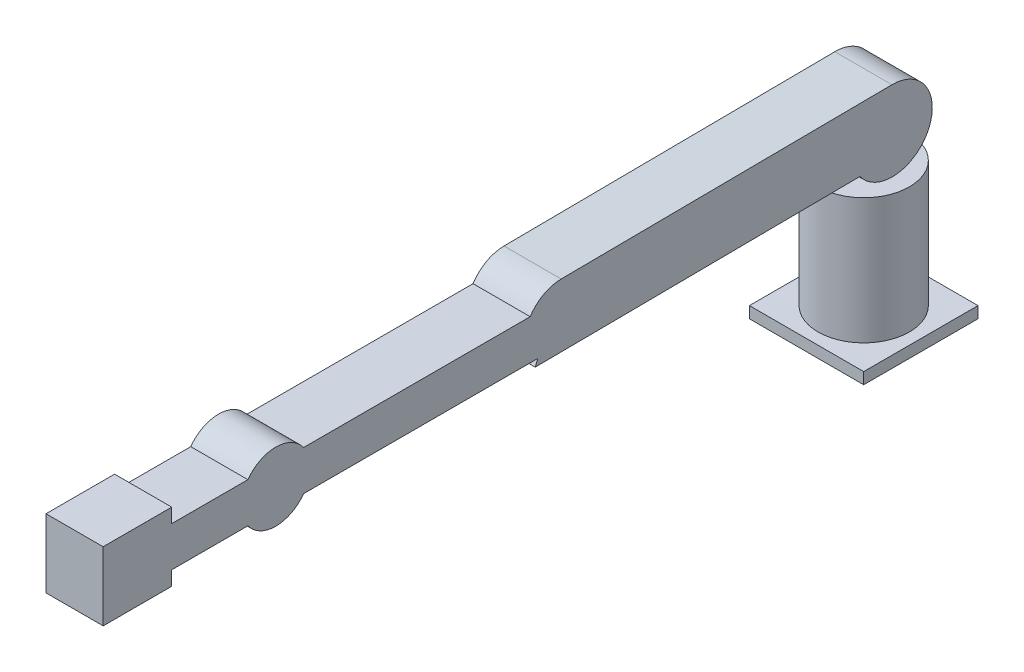
ISO-10303-21;
HEADER;
FILE_DESCRIPTION(('STEP AP214'),'2;1');
FILE_NAME('part.step','',(''),(''),'','','');
FILE_SCHEMA(('AUTOMOTIVE_DESIGN { 1 0 10303 214 1 1 1 1 }'));
ENDSEC;
DATA;
#1=APPLICATION_CONTEXT('core data for automotive mechanical design processes');
#2=APPLICATION_PROTOCOL_DEFINITION('international standard','automotive_design',2000,#1);
#3=PRODUCT_CONTEXT('',#1,'mechanical');
#4=PRODUCT('Part','Part','',(#3));
#5=PRODUCT_RELATED_PRODUCT_CATEGORY('part','',(#4));
#6=PRODUCT_DEFINITION_FORMATION('','',#4);
#7=PRODUCT_DEFINITION_CONTEXT('part definition',#1,'design');
#8=PRODUCT_DEFINITION('design','',#6,#7);
#9=PRODUCT_DEFINITION_SHAPE('','',#8);
#10=(LENGTH_UNIT() NAMED_UNIT(*) SI_UNIT(.MILLI.,.METRE.));
#11=(NAMED_UNIT(*) PLANE_ANGLE_UNIT() SI_UNIT($,.RADIAN.));
#12=(NAMED_UNIT(*) SI_UNIT($,.STERADIAN.) SOLID_ANGLE_UNIT());
#13=UNCERTAINTY_MEASURE_WITH_UNIT(LENGTH_MEASURE(1.E-05),#10,'distance_accuracy_value','');
#14=(GEOMETRIC_REPRESENTATION_CONTEXT(3) GLOBAL_UNCERTAINTY_ASSIGNED_CONTEXT((#13)) GLOBAL_UNIT_ASSIGNED_CONTEXT((#10,
#11,#12)) REPRESENTATION_CONTEXT('',''));
#15=CARTESIAN_POINT('',(0.,0.,0.));
#16=DIRECTION('',(0.,0.,1.));
#17=DIRECTION('',(1.,0.,0.));
#18=AXIS2_PLACEMENT_3D('',#15,#16,#17);
#19=CARTESIAN_POINT('',(-25.,0.,0.));
#20=DIRECTION('',(1.,0.,0.));
#21=DIRECTION('',(0.,0.,-1.));
#22=AXIS2_PLACEMENT_3D('',#19,#20,#21);
#23=PLANE('',#22);
#24=CARTESIAN_POINT('',(-25.,144.999999999996,539.396584387438));
#25=DIRECTION('',(1.,0.,0.));
#26=DIRECTION('',(0.,0.,-1.));
#27=AXIS2_PLACEMENT_3D('',#24,#25,#26);
#28=CIRCLE('',#27,30.);
#29=CARTESIAN_POINT('',(-25.,127.499999999996,563.76357024946));
#30=VERTEX_POINT('',#29);
#31=CARTESIAN_POINT('',(-25.,127.499999999997,515.029598525415));
#32=VERTEX_POINT('',#31);
#33=EDGE_CURVE('E471',#30,#32,#28,.T.);
#34=ORIENTED_EDGE('',*,*,#33,.F.);
#35=DIRECTION('',(0.,0.,1.));
#36=VECTOR('',#35,1.);
#37=CARTESIAN_POINT('',(-25.,127.499999999996,539.396584387437));
#38=LINE('',#37,#36);
#39=CARTESIAN_POINT('',(-25.,127.499999999995,630.396584387437));
#40=VERTEX_POINT('',#39);
#41=EDGE_CURVE('E452',#30,#40,#38,.T.);
#42=ORIENTED_EDGE('',*,*,#41,.T.);
#43=DIRECTION('',(0.,-1.,0.));
#44=VECTOR('',#43,1.);
#45=CARTESIAN_POINT('',(-25.,174.999999999995,630.396584387438));
#46=LINE('',#45,#44);
#47=CARTESIAN_POINT('',(-25.,114.999999999995,630.396584387437));
#48=VERTEX_POINT('',#47);
#49=EDGE_CURVE('E365',#40,#48,#46,.T.);
#50=ORIENTED_EDGE('',*,*,#49,.T.);
#51=DIRECTION('',(0.,0.,1.));
#52=VECTOR('',#51,1.);
#53=CARTESIAN_POINT('',(-25.,114.999999999995,630.396584387437));
#54=LINE('',#53,#52);
#55=CARTESIAN_POINT('',(-25.,114.999999999994,690.396584387437));
#56=VERTEX_POINT('',#55);
#57=EDGE_CURVE('E375',#48,#56,#54,.T.);
#58=ORIENTED_EDGE('',*,*,#57,.T.);
#59=DIRECTION('',(0.,1.,0.));
#60=VECTOR('',#59,1.);
#61=CARTESIAN_POINT('',(-25.,114.999999999994,690.396584387437));
#62=LINE('',#61,#60);
#63=CARTESIAN_POINT('',(-25.,174.999999999994,690.396584387438));
#64=VERTEX_POINT('',#63);
#65=EDGE_CURVE('E386',#56,#64,#62,.T.);
#66=ORIENTED_EDGE('',*,*,#65,.T.);
#67=DIRECTION('',(0.,0.,-1.));
#68=VECTOR('',#67,1.);
#69=CARTESIAN_POINT('',(-25.,174.999999999994,690.396584387438));
#70=LINE('',#69,#68);
#71=CARTESIAN_POINT('',(-25.,174.999999999995,630.396584387438));
#72=VERTEX_POINT('',#71);
#73=EDGE_CURVE('E391',#64,#72,#70,.T.);
#74=ORIENTED_EDGE('',*,*,#73,.T.);
#75=CARTESIAN_POINT('',(-25.,162.499999999995,630.396584387438));
#76=VERTEX_POINT('',#75);
#77=EDGE_CURVE('E396',#72,#76,#46,.T.);
#78=ORIENTED_EDGE('',*,*,#77,.T.);
#79=DIRECTION('',(0.,0.,-1.));
#80=VECTOR('',#79,1.);
#81=CARTESIAN_POINT('',(-25.,162.499999999995,630.396584387438));
#82=LINE('',#81,#80);
#83=CARTESIAN_POINT('',(-25.,162.499999999996,563.76357024946));
#84=VERTEX_POINT('',#83);
#85=EDGE_CURVE('E457',#76,#84,#82,.T.);
#86=ORIENTED_EDGE('',*,*,#85,.T.);
#87=CARTESIAN_POINT('',(-25.,162.499999999997,515.029598525415));
#88=VERTEX_POINT('',#87);
#89=EDGE_CURVE('E382',#88,#84,#28,.T.);
#90=ORIENTED_EDGE('',*,*,#89,.F.);
#91=DIRECTION('',(0.,0.,-1.));
#92=VECTOR('',#91,1.);
#93=CARTESIAN_POINT('',(-25.,162.499999999996,539.396584387438));
#94=LINE('',#93,#92);
#95=CARTESIAN_POINT('',(-25.,162.5,316.782712262696));
#96=VERTEX_POINT('',#95);
#97=EDGE_CURVE('E420',#88,#96,#94,.T.);
#98=ORIENTED_EDGE('',*,*,#97,.T.);
#99=CARTESIAN_POINT('',(-25.,145.,289.396584387437));
#100=DIRECTION('',(1.,0.,0.));
#101=DIRECTION('',(0.,0.,-1.));
#102=AXIS2_PLACEMENT_3D('',#99,#100,#101);
#103=CIRCLE('',#102,32.5000000000001);
#104=CARTESIAN_POINT('',(-25.,177.498787296354,289.677340983691));
#105=VERTEX_POINT('',#104);
#106=EDGE_CURVE('E519',#105,#96,#103,.T.);
#107=ORIENTED_EDGE('',*,*,#106,.F.);
#108=DIRECTION('',(0.,0.00863866450010712,-0.999962686041661));
#109=VECTOR('',#108,1.);
#110=CARTESIAN_POINT('',(-25.,177.498787296354,289.677340983691));
#111=LINE('',#110,#109);
#112=CARTESIAN_POINT('',(-25.,179.998694011458,0.302353257503749));
#113=VERTEX_POINT('',#112);
#114=EDGE_CURVE('E431',#105,#113,#111,.T.);
#115=ORIENTED_EDGE('',*,*,#114,.T.);
#116=CARTESIAN_POINT('',(-25.,145.,0.));
#117=DIRECTION('',(1.,0.,0.));
#118=DIRECTION('',(0.,0.,-1.));
#119=AXIS2_PLACEMENT_3D('',#116,#117,#118);
#120=CIRCLE('',#119,35.);
#121=CARTESIAN_POINT('',(-25.,124.472753688617,28.3484066372663));
#122=VERTEX_POINT('',#121);
#123=EDGE_CURVE('E527',#122,#113,#120,.T.);
#124=ORIENTED_EDGE('',*,*,#123,.F.);
#125=DIRECTION('',(0.,-0.00863866450010713,0.999962686041662));
#126=VECTOR('',#125,1.);
#127=CARTESIAN_POINT('',(-25.,124.708347955781,1.07735377868663));
#128=LINE('',#127,#126);
#129=CARTESIAN_POINT('',(-25.,122.019029611437,312.377554776));
#130=VERTEX_POINT('',#129);
#131=EDGE_CURVE('E559',#122,#130,#128,.T.);
#132=ORIENTED_EDGE('',*,*,#131,.T.);
#133=DIRECTION('',(0.,-0.925523866381089,0.378689282603825));
#134=VECTOR('',#133,1.);
#135=CARTESIAN_POINT('',(-25.,126.982158806123,310.34683044519));
#136=LINE('',#135,#134);
#137=CARTESIAN_POINT('',(-25.,127.5,310.134949458286));
#138=VERTEX_POINT('',#137);
#139=EDGE_CURVE('E531',#138,#130,#136,.T.);
#140=ORIENTED_EDGE('',*,*,#139,.F.);
#141=DIRECTION('',(0.,0.,1.));
#142=VECTOR('',#141,1.);
#143=CARTESIAN_POINT('',(-25.,127.5,289.396584387437));
#144=LINE('',#143,#142);
#145=EDGE_CURVE('E438',#138,#32,#144,.T.);
#146=ORIENTED_EDGE('',*,*,#145,.T.);
#147=EDGE_LOOP('',(#34,#42,#50,#58,#66,#74,#78,#86,#90,#98,#107,#115,#124,#132,#140,#146));
#148=FACE_BOUND('',#147,.T.);
#149=ADVANCED_FACE('F255',(#148),#23,.F.);
#150=CARTESIAN_POINT('',(25.,145.,0.));
#151=DIRECTION('',(-1.,0.,0.));
#152=DIRECTION('',(0.,0.,1.));
#153=AXIS2_PLACEMENT_3D('',#150,#151,#152);
#154=CYLINDRICAL_SURFACE('',#153,35.);
#155=DIRECTION('',(-1.,0.,0.));
#156=VECTOR('',#155,1.);
#157=CARTESIAN_POINT('',(25.,179.998694011458,0.30235325750375));
#158=LINE('',#157,#156);
#159=CARTESIAN_POINT('',(25.,179.998694011458,0.30235325750375));
#160=VERTEX_POINT('',#159);
#161=EDGE_CURVE('E13',#160,#113,#158,.T.);
#162=ORIENTED_EDGE('',*,*,#161,.F.);
#163=CARTESIAN_POINT('',(25.,145.,0.));
#164=DIRECTION('',(1.,0.,0.));
#165=DIRECTION('',(0.,0.,-1.));
#166=AXIS2_PLACEMENT_3D('',#163,#164,#165);
#167=CIRCLE('',#166,35.);
#168=CARTESIAN_POINT('',(25.,124.472753688617,28.3484066372663));
#169=VERTEX_POINT('',#168);
#170=EDGE_CURVE('E545',#169,#160,#167,.T.);
#171=ORIENTED_EDGE('',*,*,#170,.F.);
#172=DIRECTION('',(-1.,0.,0.));
#173=VECTOR('',#172,1.);
#174=CARTESIAN_POINT('',(25.,124.472753688617,28.3484066372663));
#175=LINE('',#174,#173);
#176=EDGE_CURVE('E266',#169,#122,#175,.T.);
#177=ORIENTED_EDGE('',*,*,#176,.T.);
#178=ORIENTED_EDGE('',*,*,#123,.T.);
#179=EDGE_LOOP('',(#162,#171,#177,#178));
#180=FACE_BOUND('',#179,.T.);
#181=ADVANCED_FACE('F542',(#180),#154,.T.);
#182=CARTESIAN_POINT('',(25.,0.,0.));
#183=DIRECTION('',(1.,0.,0.));
#184=DIRECTION('',(0.,0.,-1.));
#185=AXIS2_PLACEMENT_3D('',#182,#183,#184);
#186=PLANE('',#185);
#187=DIRECTION('',(0.,0.,1.));
#188=VECTOR('',#187,1.);
#189=CARTESIAN_POINT('',(25.,127.499999999996,539.396584387437));
#190=LINE('',#189,#188);
#191=CARTESIAN_POINT('',(25.,127.499999999996,563.76357024946));
#192=VERTEX_POINT('',#191);
#193=CARTESIAN_POINT('',(25.,127.499999999995,630.396584387437));
#194=VERTEX_POINT('',#193);
#195=EDGE_CURVE('E451',#192,#194,#190,.T.);
#196=ORIENTED_EDGE('',*,*,#195,.F.);
#197=CARTESIAN_POINT('',(25.,144.999999999996,539.396584387438));
#198=DIRECTION('',(1.,0.,0.));
#199=DIRECTION('',(0.,0.,-1.));
#200=AXIS2_PLACEMENT_3D('',#197,#198,#199);
#201=CIRCLE('',#200,30.);
#202=CARTESIAN_POINT('',(25.,127.499999999997,515.029598525415));
#203=VERTEX_POINT('',#202);
#204=EDGE_CURVE('E461',#192,#203,#201,.T.);
#205=ORIENTED_EDGE('',*,*,#204,.T.);
#206=DIRECTION('',(0.,0.,1.));
#207=VECTOR('',#206,1.);
#208=CARTESIAN_POINT('',(25.,127.5,289.396584387437));
#209=LINE('',#208,#207);
#210=CARTESIAN_POINT('',(25.,127.5,310.134949458286));
#211=VERTEX_POINT('',#210);
#212=EDGE_CURVE('E423',#211,#203,#209,.T.);
#213=ORIENTED_EDGE('',*,*,#212,.F.);
#214=DIRECTION('',(0.,-0.925523866381089,0.378689282603825));
#215=VECTOR('',#214,1.);
#216=CARTESIAN_POINT('',(25.,126.982158806123,310.34683044519));
#217=LINE('',#216,#215);
#218=CARTESIAN_POINT('',(25.,122.019029611437,312.377554776));
#219=VERTEX_POINT('',#218);
#220=EDGE_CURVE('E552',#211,#219,#217,.T.);
#221=ORIENTED_EDGE('',*,*,#220,.T.);
#222=DIRECTION('',(0.,-0.00863866450010713,0.999962686041662));
#223=VECTOR('',#222,1.);
#224=CARTESIAN_POINT('',(25.,124.708347955781,1.07735377868663));
#225=LINE('',#224,#223);
#226=EDGE_CURVE('E275',#169,#219,#225,.T.);
#227=ORIENTED_EDGE('',*,*,#226,.F.);
#228=ORIENTED_EDGE('',*,*,#170,.T.);
#229=DIRECTION('',(0.,0.00863866450010712,-0.999962686041661));
#230=VECTOR('',#229,1.);
#231=CARTESIAN_POINT('',(25.,177.498787296354,289.677340983691));
#232=LINE('',#231,#230);
#233=CARTESIAN_POINT('',(25.,177.498787296354,289.677340983691));
#234=VERTEX_POINT('',#233);
#235=EDGE_CURVE('E528',#234,#160,#232,.T.);
#236=ORIENTED_EDGE('',*,*,#235,.F.);
#237=CARTESIAN_POINT('',(25.,145.,289.396584387437));
#238=DIRECTION('',(1.,0.,0.));
#239=DIRECTION('',(0.,0.,-1.));
#240=AXIS2_PLACEMENT_3D('',#237,#238,#239);
#241=CIRCLE('',#240,32.5000000000001);
#242=CARTESIAN_POINT('',(25.,162.5,316.782712262696));
#243=VERTEX_POINT('',#242);
#244=EDGE_CURVE('E511',#234,#243,#241,.T.);
#245=ORIENTED_EDGE('',*,*,#244,.T.);
#246=DIRECTION('',(0.,0.,-1.));
#247=VECTOR('',#246,1.);
#248=CARTESIAN_POINT('',(25.,162.499999999996,539.396584387438));
#249=LINE('',#248,#247);
#250=CARTESIAN_POINT('',(25.,162.499999999997,515.029598525415));
#251=VERTEX_POINT('',#250);
#252=EDGE_CURVE('E432',#251,#243,#249,.T.);
#253=ORIENTED_EDGE('',*,*,#252,.F.);
#254=CARTESIAN_POINT('',(25.,162.499999999996,563.76357024946));
#255=VERTEX_POINT('',#254);
#256=EDGE_CURVE('E468',#251,#255,#201,.T.);
#257=ORIENTED_EDGE('',*,*,#256,.T.);
#258=DIRECTION('',(0.,0.,-1.));
#259=VECTOR('',#258,1.);
#260=CARTESIAN_POINT('',(25.,162.499999999995,630.396584387438));
#261=LINE('',#260,#259);
#262=CARTESIAN_POINT('',(25.,162.499999999995,630.396584387438));
#263=VERTEX_POINT('',#262);
#264=EDGE_CURVE('E447',#263,#255,#261,.T.);
#265=ORIENTED_EDGE('',*,*,#264,.F.);
#266=DIRECTION('',(0.,-1.,0.));
#267=VECTOR('',#266,1.);
#268=CARTESIAN_POINT('',(25.,174.999999999995,630.396584387438));
#269=LINE('',#268,#267);
#270=CARTESIAN_POINT('',(25.,174.999999999995,630.396584387438));
#271=VERTEX_POINT('',#270);
#272=EDGE_CURVE('E479',#271,#263,#269,.T.);
#273=ORIENTED_EDGE('',*,*,#272,.F.);
#274=DIRECTION('',(0.,0.,-1.));
#275=VECTOR('',#274,1.);
#276=CARTESIAN_POINT('',(25.,174.999999999994,690.396584387438));
#277=LINE('',#276,#275);
#278=CARTESIAN_POINT('',(25.,174.999999999994,690.396584387438));
#279=VERTEX_POINT('',#278);
#280=EDGE_CURVE('E400',#279,#271,#277,.T.);
#281=ORIENTED_EDGE('',*,*,#280,.F.);
#282=DIRECTION('',(0.,1.,0.));
#283=VECTOR('',#282,1.);
#284=CARTESIAN_POINT('',(25.,114.999999999994,690.396584387437));
#285=LINE('',#284,#283);
#286=CARTESIAN_POINT('',(25.,114.999999999994,690.396584387437));
#287=VERTEX_POINT('',#286);
#288=EDGE_CURVE('E395',#287,#279,#285,.T.);
#289=ORIENTED_EDGE('',*,*,#288,.F.);
#290=DIRECTION('',(0.,0.,1.));
#291=VECTOR('',#290,1.);
#292=CARTESIAN_POINT('',(25.,114.999999999995,630.396584387437));
#293=LINE('',#292,#291);
#294=CARTESIAN_POINT('',(25.,114.999999999995,630.396584387437));
#295=VERTEX_POINT('',#294);
#296=EDGE_CURVE('E377',#295,#287,#293,.T.);
#297=ORIENTED_EDGE('',*,*,#296,.F.);
#298=EDGE_CURVE('E478',#194,#295,#269,.T.);
#299=ORIENTED_EDGE('',*,*,#298,.F.);
#300=EDGE_LOOP('',(#196,#205,#213,#221,#227,#228,#236,#245,#253,#257,#265,#273,#281,#289,#297,#299));
#301=FACE_BOUND('',#300,.T.);
#302=ADVANCED_FACE('F568',(#301),#186,.T.);
#303=CARTESIAN_POINT('',(25.,114.999999999994,690.396584387437));
#304=DIRECTION('',(0.,0.,1.));
#305=DIRECTION('',(0.,-1.,0.));
#306=AXIS2_PLACEMENT_3D('',#303,#304,#305);
#307=PLANE('',#306);
#308=ORIENTED_EDGE('',*,*,#65,.F.);
#309=DIRECTION('',(-1.,0.,0.));
#310=VECTOR('',#309,1.);
#311=CARTESIAN_POINT('',(25.,114.999999999994,690.396584387437));
#312=LINE('',#311,#310);
#313=EDGE_CURVE('E371',#287,#56,#312,.T.);
#314=ORIENTED_EDGE('',*,*,#313,.F.);
#315=ORIENTED_EDGE('',*,*,#288,.T.);
#316=DIRECTION('',(-1.,0.,0.));
#317=VECTOR('',#316,1.);
#318=CARTESIAN_POINT('',(25.,174.999999999994,690.396584387438));
#319=LINE('',#318,#317);
#320=EDGE_CURVE('E387',#279,#64,#319,.T.);
#321=ORIENTED_EDGE('',*,*,#320,.T.);
#322=EDGE_LOOP('',(#308,#314,#315,#321));
#323=FACE_BOUND('',#322,.T.);
#324=ADVANCED_FACE('F257',(#323),#307,.T.);
#325=CARTESIAN_POINT('',(25.,114.999999999995,630.396584387437));
#326=DIRECTION('',(0.,-1.,0.));
#327=DIRECTION('',(0.,0.,-1.));
#328=AXIS2_PLACEMENT_3D('',#325,#326,#327);
#329=PLANE('',#328);
#330=ORIENTED_EDGE('',*,*,#57,.F.);
#331=DIRECTION('',(-1.,0.,0.));
#332=VECTOR('',#331,1.);
#333=CARTESIAN_POINT('',(25.,114.999999999995,630.396584387437));
#334=LINE('',#333,#332);
#335=EDGE_CURVE('E383',#295,#48,#334,.T.);
#336=ORIENTED_EDGE('',*,*,#335,.F.);
#337=ORIENTED_EDGE('',*,*,#296,.T.);
#338=ORIENTED_EDGE('',*,*,#313,.T.);
#339=EDGE_LOOP('',(#330,#336,#337,#338));
#340=FACE_BOUND('',#339,.T.);
#341=ADVANCED_FACE('F373',(#340),#329,.T.);
#342=CARTESIAN_POINT('',(25.,174.999999999994,690.396584387438));
#343=DIRECTION('',(0.,1.,0.));
#344=DIRECTION('',(0.,0.,1.));
#345=AXIS2_PLACEMENT_3D('',#342,#343,#344);
#346=PLANE('',#345);
#347=ORIENTED_EDGE('',*,*,#73,.F.);
#348=ORIENTED_EDGE('',*,*,#320,.F.);
#349=ORIENTED_EDGE('',*,*,#280,.T.);
#350=DIRECTION('',(-1.,0.,0.));
#351=VECTOR('',#350,1.);
#352=CARTESIAN_POINT('',(25.,174.999999999995,630.396584387438));
#353=LINE('',#352,#351);
#354=EDGE_CURVE('E408',#271,#72,#353,.T.);
#355=ORIENTED_EDGE('',*,*,#354,.T.);
#356=EDGE_LOOP('',(#347,#348,#349,#355));
#357=FACE_BOUND('',#356,.T.);
#358=ADVANCED_FACE('F489',(#357),#346,.T.);
#359=CARTESIAN_POINT('',(25.,174.999999999995,630.396584387438));
#360=DIRECTION('',(0.,0.,-1.));
#361=DIRECTION('',(0.,1.,0.));
#362=AXIS2_PLACEMENT_3D('',#359,#360,#361);
#363=PLANE('',#362);
#364=DIRECTION('',(-1.,0.,0.));
#365=VECTOR('',#364,1.);
#366=CARTESIAN_POINT('',(25.,127.499999999995,630.396584387437));
#367=LINE('',#366,#365);
#368=EDGE_CURVE('E456',#194,#40,#367,.T.);
#369=ORIENTED_EDGE('',*,*,#368,.F.);
#370=ORIENTED_EDGE('',*,*,#298,.T.);
#371=ORIENTED_EDGE('',*,*,#335,.T.);
#372=ORIENTED_EDGE('',*,*,#49,.F.);
#373=EDGE_LOOP('',(#369,#370,#371,#372));
#374=FACE_BOUND('',#373,.T.);
#375=ADVANCED_FACE('F682',(#374),#363,.T.);
#376=ORIENTED_EDGE('',*,*,#272,.T.);
#377=DIRECTION('',(-1.,0.,0.));
#378=VECTOR('',#377,1.);
#379=CARTESIAN_POINT('',(25.,162.499999999995,630.396584387438));
#380=LINE('',#379,#378);
#381=EDGE_CURVE('E417',#263,#76,#380,.T.);
#382=ORIENTED_EDGE('',*,*,#381,.T.);
#383=ORIENTED_EDGE('',*,*,#77,.F.);
#384=ORIENTED_EDGE('',*,*,#354,.F.);
#385=EDGE_LOOP('',(#376,#382,#383,#384));
#386=FACE_BOUND('',#385,.T.);
#387=ADVANCED_FACE('F493',(#386),#363,.T.);
#388=CARTESIAN_POINT('',(25.,127.499999999996,539.396584387437));
#389=DIRECTION('',(0.,-1.,0.));
#390=DIRECTION('',(0.,0.,-1.));
#391=AXIS2_PLACEMENT_3D('',#388,#389,#390);
#392=PLANE('',#391);
#393=ORIENTED_EDGE('',*,*,#41,.F.);
#394=DIRECTION('',(-1.,0.,0.));
#395=VECTOR('',#394,1.);
#396=CARTESIAN_POINT('',(25.,127.499999999996,563.76357024946));
#397=LINE('',#396,#395);
#398=EDGE_CURVE('E413',#30,#192,#397,.F.);
#399=ORIENTED_EDGE('',*,*,#398,.T.);
#400=ORIENTED_EDGE('',*,*,#195,.T.);
#401=ORIENTED_EDGE('',*,*,#368,.T.);
#402=EDGE_LOOP('',(#393,#399,#400,#401));
#403=FACE_BOUND('',#402,.T.);
#404=ADVANCED_FACE('F609',(#403),#392,.T.);
#405=CARTESIAN_POINT('',(25.,162.499999999995,630.396584387438));
#406=DIRECTION('',(0.,1.,0.));
#407=DIRECTION('',(0.,0.,1.));
#408=AXIS2_PLACEMENT_3D('',#405,#406,#407);
#409=PLANE('',#408);
#410=ORIENTED_EDGE('',*,*,#264,.T.);
#411=DIRECTION('',(-1.,0.,0.));
#412=VECTOR('',#411,1.);
#413=CARTESIAN_POINT('',(25.,162.499999999996,563.76357024946));
#414=LINE('',#413,#412);
#415=EDGE_CURVE('E416',#255,#84,#414,.T.);
#416=ORIENTED_EDGE('',*,*,#415,.T.);
#417=ORIENTED_EDGE('',*,*,#85,.F.);
#418=ORIENTED_EDGE('',*,*,#381,.F.);
#419=EDGE_LOOP('',(#410,#416,#417,#418));
#420=FACE_BOUND('',#419,.T.);
#421=ADVANCED_FACE('F496',(#420),#409,.T.);
#422=CARTESIAN_POINT('',(25.,144.999999999996,539.396584387438));
#423=DIRECTION('',(-1.,0.,0.));
#424=DIRECTION('',(0.,0.,1.));
#425=AXIS2_PLACEMENT_3D('',#422,#423,#424);
#426=CYLINDRICAL_SURFACE('',#425,30.);
#427=DIRECTION('',(-1.,0.,0.));
#428=VECTOR('',#427,1.);
#429=CARTESIAN_POINT('',(25.,127.499999999997,515.029598525415));
#430=LINE('',#429,#428);
#431=EDGE_CURVE('E259',#203,#32,#430,.T.);
#432=ORIENTED_EDGE('',*,*,#431,.F.);
#433=ORIENTED_EDGE('',*,*,#204,.F.);
#434=ORIENTED_EDGE('',*,*,#398,.F.);
#435=ORIENTED_EDGE('',*,*,#33,.T.);
#436=EDGE_LOOP('',(#432,#433,#434,#435));
#437=FACE_BOUND('',#436,.T.);
#438=ADVANCED_FACE('F572',(#437),#426,.T.);
#439=DIRECTION('',(-1.,0.,0.));
#440=VECTOR('',#439,1.);
#441=CARTESIAN_POINT('',(25.,162.499999999997,515.029598525415));
#442=LINE('',#441,#440);
#443=EDGE_CURVE('E421',#88,#251,#442,.F.);
#444=ORIENTED_EDGE('',*,*,#443,.F.);
#445=ORIENTED_EDGE('',*,*,#89,.T.);
#446=ORIENTED_EDGE('',*,*,#415,.F.);
#447=ORIENTED_EDGE('',*,*,#256,.F.);
#448=EDGE_LOOP('',(#444,#445,#446,#447));
#449=FACE_BOUND('',#448,.T.);
#450=ADVANCED_FACE('F569',(#449),#426,.T.);
#451=CARTESIAN_POINT('',(25.,127.5,289.396584387437));
#452=DIRECTION('',(0.,-1.,0.));
#453=DIRECTION('',(0.,0.,-1.));
#454=AXIS2_PLACEMENT_3D('',#451,#452,#453);
#455=PLANE('',#454);
#456=DIRECTION('',(-1.,0.,0.));
#457=VECTOR('',#456,1.);
#458=CARTESIAN_POINT('',(25.,127.5,310.134949458286));
#459=LINE('',#458,#457);
#460=EDGE_CURVE('E515',#211,#138,#459,.T.);
#461=ORIENTED_EDGE('',*,*,#460,.F.);
#462=ORIENTED_EDGE('',*,*,#212,.T.);
#463=ORIENTED_EDGE('',*,*,#431,.T.);
#464=ORIENTED_EDGE('',*,*,#145,.F.);
#465=EDGE_LOOP('',(#461,#462,#463,#464));
#466=FACE_BOUND('',#465,.T.);
#467=ADVANCED_FACE('F571',(#466),#455,.T.);
#468=CARTESIAN_POINT('',(25.,162.499999999996,539.396584387438));
#469=DIRECTION('',(0.,1.,0.));
#470=DIRECTION('',(0.,0.,1.));
#471=AXIS2_PLACEMENT_3D('',#468,#469,#470);
#472=PLANE('',#471);
#473=DIRECTION('',(-1.,0.,0.));
#474=VECTOR('',#473,1.);
#475=CARTESIAN_POINT('',(25.,162.5,316.782712262696));
#476=LINE('',#475,#474);
#477=EDGE_CURVE('E504',#243,#96,#476,.T.);
#478=ORIENTED_EDGE('',*,*,#477,.T.);
#479=ORIENTED_EDGE('',*,*,#97,.F.);
#480=ORIENTED_EDGE('',*,*,#443,.T.);
#481=ORIENTED_EDGE('',*,*,#252,.T.);
#482=EDGE_LOOP('',(#478,#479,#480,#481));
#483=FACE_BOUND('',#482,.T.);
#484=ADVANCED_FACE('F503',(#483),#472,.T.);
#485=CARTESIAN_POINT('',(25.,126.982158806123,310.34683044519));
#486=DIRECTION('',(0.,-0.378689282603825,-0.925523866381089));
#487=DIRECTION('',(0.,0.925523866381089,-0.378689282603825));
#488=AXIS2_PLACEMENT_3D('',#485,#486,#487);
#489=PLANE('',#488);
#490=ORIENTED_EDGE('',*,*,#139,.T.);
#491=DIRECTION('',(-1.,0.,0.));
#492=VECTOR('',#491,1.);
#493=CARTESIAN_POINT('',(25.,122.019029611437,312.377554776));
#494=LINE('',#493,#492);
#495=EDGE_CURVE('E510',#219,#130,#494,.T.);
#496=ORIENTED_EDGE('',*,*,#495,.F.);
#497=ORIENTED_EDGE('',*,*,#220,.F.);
#498=ORIENTED_EDGE('',*,*,#460,.T.);
#499=EDGE_LOOP('',(#490,#496,#497,#498));
#500=FACE_BOUND('',#499,.T.);
#501=ADVANCED_FACE('F598',(#500),#489,.F.);
#502=CARTESIAN_POINT('',(25.,145.,289.396584387437));
#503=DIRECTION('',(-1.,0.,0.));
#504=DIRECTION('',(0.,0.,1.));
#505=AXIS2_PLACEMENT_3D('',#502,#503,#504);
#506=CYLINDRICAL_SURFACE('',#505,32.5000000000001);
#507=ORIENTED_EDGE('',*,*,#244,.F.);
#508=DIRECTION('',(-1.,0.,0.));
#509=VECTOR('',#508,1.);
#510=CARTESIAN_POINT('',(25.,177.498787296354,289.677340983691));
#511=LINE('',#510,#509);
#512=EDGE_CURVE('E524',#234,#105,#511,.T.);
#513=ORIENTED_EDGE('',*,*,#512,.T.);
#514=ORIENTED_EDGE('',*,*,#106,.T.);
#515=ORIENTED_EDGE('',*,*,#477,.F.);
#516=EDGE_LOOP('',(#507,#513,#514,#515));
#517=FACE_BOUND('',#516,.T.);
#518=ADVANCED_FACE('F564',(#517),#506,.T.);
#519=CARTESIAN_POINT('',(25.,124.708347955781,1.07735377868663));
#520=DIRECTION('',(0.,-0.999962686041662,-0.00863866450010713));
#521=DIRECTION('',(0.,0.00863866450010713,-0.999962686041662));
#522=AXIS2_PLACEMENT_3D('',#519,#520,#521);
#523=PLANE('',#522);
#524=ORIENTED_EDGE('',*,*,#131,.F.);
#525=ORIENTED_EDGE('',*,*,#176,.F.);
#526=ORIENTED_EDGE('',*,*,#226,.T.);
#527=ORIENTED_EDGE('',*,*,#495,.T.);
#528=EDGE_LOOP('',(#524,#525,#526,#527));
#529=FACE_BOUND('',#528,.T.);
#530=ADVANCED_FACE('F597',(#529),#523,.T.);
#531=CARTESIAN_POINT('',(25.,177.498787296354,289.677340983691));
#532=DIRECTION('',(0.,0.999962686041662,0.00863866450010713));
#533=DIRECTION('',(0.,-0.00863866450010713,0.999962686041662));
#534=AXIS2_PLACEMENT_3D('',#531,#532,#533);
#535=PLANE('',#534);
#536=ORIENTED_EDGE('',*,*,#114,.F.);
#537=ORIENTED_EDGE('',*,*,#512,.F.);
#538=ORIENTED_EDGE('',*,*,#235,.T.);
#539=ORIENTED_EDGE('',*,*,#161,.T.);
#540=EDGE_LOOP('',(#536,#537,#538,#539));
#541=FACE_BOUND('',#540,.T.);
#542=ADVANCED_FACE('F566',(#541),#535,.T.);
#543=CLOSED_SHELL('',(#149,#181,#302,#324,#341,#358,#375,#387,#404,#421,#438,#450,#467,#484,
#501,#518,#530,#542));
#544=MANIFOLD_SOLID_BREP('B2',#543);
#545=CARTESIAN_POINT('',(0.,110.,0.));
#546=DIRECTION('',(0.,-1.,0.));
#547=DIRECTION('',(0.,0.,-1.));
#548=AXIS2_PLACEMENT_3D('',#545,#546,#547);
#549=CYLINDRICAL_SURFACE('',#548,40.);
#550=CARTESIAN_POINT('',(0.,110.,0.));
#551=DIRECTION('',(0.,1.,0.));
#552=DIRECTION('',(0.,0.,1.));
#553=AXIS2_PLACEMENT_3D('',#550,#551,#552);
#554=CIRCLE('',#553,40.);
#555=CARTESIAN_POINT('',(0.,110.,40.));
#556=VERTEX_POINT('',#555);
#557=EDGE_CURVE('E253',#556,#556,#554,.T.);
#558=ORIENTED_EDGE('',*,*,#557,.F.);
#559=EDGE_LOOP('',(#558));
#560=FACE_BOUND('',#559,.T.);
#561=CARTESIAN_POINT('',(0.,0.,0.));
#562=DIRECTION('',(0.,1.,0.));
#563=DIRECTION('',(0.,0.,1.));
#564=AXIS2_PLACEMENT_3D('',#561,#562,#563);
#565=CIRCLE('',#564,40.);
#566=CARTESIAN_POINT('',(0.,0.,40.));
#567=VERTEX_POINT('',#566);
#568=EDGE_CURVE('E787',#567,#567,#565,.T.);
#569=ORIENTED_EDGE('',*,*,#568,.T.);
#570=EDGE_LOOP('',(#569));
#571=FACE_BOUND('',#570,.T.);
#572=ADVANCED_FACE('F784',(#560,#571),#549,.T.);
#573=CARTESIAN_POINT('',(0.,110.,0.));
#574=DIRECTION('',(0.,1.,0.));
#575=DIRECTION('',(0.,0.,1.));
#576=AXIS2_PLACEMENT_3D('',#573,#574,#575);
#577=PLANE('',#576);
#578=ORIENTED_EDGE('',*,*,#557,.T.);
#579=EDGE_LOOP('',(#578));
#580=FACE_BOUND('',#579,.T.);
#581=ADVANCED_FACE('F880',(#580),#577,.T.);
#582=CARTESIAN_POINT('',(50.,-10.,50.));
#583=DIRECTION('',(-1.,0.,0.));
#584=DIRECTION('',(0.,0.,1.));
#585=AXIS2_PLACEMENT_3D('',#582,#583,#584);
#586=PLANE('',#585);
#587=DIRECTION('',(0.,0.,1.));
#588=VECTOR('',#587,1.);
#589=CARTESIAN_POINT('',(50.,0.,50.));
#590=LINE('',#589,#588);
#591=CARTESIAN_POINT('',(50.,0.,-50.));
#592=VERTEX_POINT('',#591);
#593=CARTESIAN_POINT('',(50.,0.,50.));
#594=VERTEX_POINT('',#593);
#595=EDGE_CURVE('E851',#592,#594,#590,.T.);
#596=ORIENTED_EDGE('',*,*,#595,.T.);
#597=DIRECTION('',(0.,1.,0.));
#598=VECTOR('',#597,1.);
#599=CARTESIAN_POINT('',(50.,-10.,50.));
#600=LINE('',#599,#598);
#601=CARTESIAN_POINT('',(50.,-10.,50.));
#602=VERTEX_POINT('',#601);
#603=EDGE_CURVE('E842',#602,#594,#600,.T.);
#604=ORIENTED_EDGE('',*,*,#603,.F.);
#605=DIRECTION('',(0.,0.,1.));
#606=VECTOR('',#605,1.);
#607=CARTESIAN_POINT('',(50.,-10.,50.));
#608=LINE('',#607,#606);
#609=CARTESIAN_POINT('',(50.,-10.,-50.));
#610=VERTEX_POINT('',#609);
#611=EDGE_CURVE('E836',#610,#602,#608,.T.);
#612=ORIENTED_EDGE('',*,*,#611,.F.);
#613=DIRECTION('',(0.,1.,0.));
#614=VECTOR('',#613,1.);
#615=CARTESIAN_POINT('',(50.,-10.,-50.));
#616=LINE('',#615,#614);
#617=EDGE_CURVE('E847',#610,#592,#616,.T.);
#618=ORIENTED_EDGE('',*,*,#617,.T.);
#619=EDGE_LOOP('',(#596,#604,#612,#618));
#620=FACE_BOUND('',#619,.T.);
#621=ADVANCED_FACE('F869',(#620),#586,.F.);
#622=CARTESIAN_POINT('',(-50.,-10.,50.));
#623=DIRECTION('',(0.,0.,-1.));
#624=DIRECTION('',(-1.,0.,0.));
#625=AXIS2_PLACEMENT_3D('',#622,#623,#624);
#626=PLANE('',#625);
#627=DIRECTION('',(-1.,0.,0.));
#628=VECTOR('',#627,1.);
#629=CARTESIAN_POINT('',(-50.,0.,50.));
#630=LINE('',#629,#628);
#631=CARTESIAN_POINT('',(-50.,0.,50.));
#632=VERTEX_POINT('',#631);
#633=EDGE_CURVE('E841',#594,#632,#630,.T.);
#634=ORIENTED_EDGE('',*,*,#633,.T.);
#635=DIRECTION('',(0.,1.,0.));
#636=VECTOR('',#635,1.);
#637=CARTESIAN_POINT('',(-50.,-10.,50.));
#638=LINE('',#637,#636);
#639=CARTESIAN_POINT('',(-50.,-10.,50.));
#640=VERTEX_POINT('',#639);
#641=EDGE_CURVE('E839',#640,#632,#638,.T.);
#642=ORIENTED_EDGE('',*,*,#641,.F.);
#643=DIRECTION('',(-1.,0.,0.));
#644=VECTOR('',#643,1.);
#645=CARTESIAN_POINT('',(-50.,-10.,50.));
#646=LINE('',#645,#644);
#647=EDGE_CURVE('E831',#602,#640,#646,.T.);
#648=ORIENTED_EDGE('',*,*,#647,.F.);
#649=ORIENTED_EDGE('',*,*,#603,.T.);
#650=EDGE_LOOP('',(#634,#642,#648,#649));
#651=FACE_BOUND('',#650,.T.);
#652=ADVANCED_FACE('F840',(#651),#626,.F.);
#653=CARTESIAN_POINT('',(-50.,-10.,50.));
#654=DIRECTION('',(1.,0.,0.));
#655=DIRECTION('',(0.,0.,-1.));
#656=AXIS2_PLACEMENT_3D('',#653,#654,#655);
#657=PLANE('',#656);
#658=DIRECTION('',(0.,0.,-1.));
#659=VECTOR('',#658,1.);
#660=CARTESIAN_POINT('',(-50.,0.,50.));
#661=LINE('',#660,#659);
#662=CARTESIAN_POINT('',(-50.,0.,-50.));
#663=VERTEX_POINT('',#662);
#664=EDGE_CURVE('E817',#632,#663,#661,.T.);
#665=ORIENTED_EDGE('',*,*,#664,.T.);
#666=DIRECTION('',(0.,1.,0.));
#667=VECTOR('',#666,1.);
#668=CARTESIAN_POINT('',(-50.,-10.,-50.));
#669=LINE('',#668,#667);
#670=CARTESIAN_POINT('',(-50.,-10.,-50.));
#671=VERTEX_POINT('',#670);
#672=EDGE_CURVE('E843',#671,#663,#669,.T.);
#673=ORIENTED_EDGE('',*,*,#672,.F.);
#674=DIRECTION('',(0.,0.,-1.));
#675=VECTOR('',#674,1.);
#676=CARTESIAN_POINT('',(-50.,-10.,50.));
#677=LINE('',#676,#675);
#678=EDGE_CURVE('E834',#640,#671,#677,.T.);
#679=ORIENTED_EDGE('',*,*,#678,.F.);
#680=ORIENTED_EDGE('',*,*,#641,.T.);
#681=EDGE_LOOP('',(#665,#673,#679,#680));
#682=FACE_BOUND('',#681,.T.);
#683=ADVANCED_FACE('F845',(#682),#657,.F.);
#684=CARTESIAN_POINT('',(-50.,-10.,-50.));
#685=DIRECTION('',(0.,0.,1.));
#686=DIRECTION('',(1.,0.,0.));
#687=AXIS2_PLACEMENT_3D('',#684,#685,#686);
#688=PLANE('',#687);
#689=DIRECTION('',(1.,0.,0.));
#690=VECTOR('',#689,1.);
#691=CARTESIAN_POINT('',(-50.,0.,-50.));
#692=LINE('',#691,#690);
#693=EDGE_CURVE('E823',#663,#592,#692,.T.);
#694=ORIENTED_EDGE('',*,*,#693,.T.);
#695=ORIENTED_EDGE('',*,*,#617,.F.);
#696=DIRECTION('',(1.,0.,0.));
#697=VECTOR('',#696,1.);
#698=CARTESIAN_POINT('',(-50.,-10.,-50.));
#699=LINE('',#698,#697);
#700=EDGE_CURVE('E800',#671,#610,#699,.T.);
#701=ORIENTED_EDGE('',*,*,#700,.F.);
#702=ORIENTED_EDGE('',*,*,#672,.T.);
#703=EDGE_LOOP('',(#694,#695,#701,#702));
#704=FACE_BOUND('',#703,.T.);
#705=ADVANCED_FACE('F870',(#704),#688,.F.);
#706=CARTESIAN_POINT('',(0.,-10.,0.));
#707=DIRECTION('',(0.,-1.,0.));
#708=DIRECTION('',(0.,0.,-1.));
#709=AXIS2_PLACEMENT_3D('',#706,#707,#708);
#710=PLANE('',#709);
#711=ORIENTED_EDGE('',*,*,#611,.T.);
#712=ORIENTED_EDGE('',*,*,#647,.T.);
#713=ORIENTED_EDGE('',*,*,#678,.T.);
#714=ORIENTED_EDGE('',*,*,#700,.T.);
#715=EDGE_LOOP('',(#711,#712,#713,#714));
#716=FACE_BOUND('',#715,.T.);
#717=ADVANCED_FACE('F832',(#716),#710,.T.);
#718=CARTESIAN_POINT('',(0.,0.,0.));
#719=DIRECTION('',(0.,-1.,0.));
#720=DIRECTION('',(0.,0.,-1.));
#721=AXIS2_PLACEMENT_3D('',#718,#719,#720);
#722=PLANE('',#721);
#723=ORIENTED_EDGE('',*,*,#568,.F.);
#724=EDGE_LOOP('',(#723));
#725=FACE_BOUND('',#724,.T.);
#726=ORIENTED_EDGE('',*,*,#595,.F.);
#727=ORIENTED_EDGE('',*,*,#693,.F.);
#728=ORIENTED_EDGE('',*,*,#664,.F.);
#729=ORIENTED_EDGE('',*,*,#633,.F.);
#730=EDGE_LOOP('',(#726,#727,#728,#729));
#731=FACE_BOUND('',#730,.T.);
#732=ADVANCED_FACE('F863',(#725,#731),#722,.F.);
#733=CLOSED_SHELL('',(#572,#581,#621,#652,#683,#705,#717,#732));
#734=MANIFOLD_SOLID_BREP('B7',#733);
#735=ADVANCED_BREP_SHAPE_REPRESENTATION('',(#18,#544,#734),#14);
#736=SHAPE_DEFINITION_REPRESENTATION(#9,#735);
ENDSEC;
END-ISO-10303-21;
